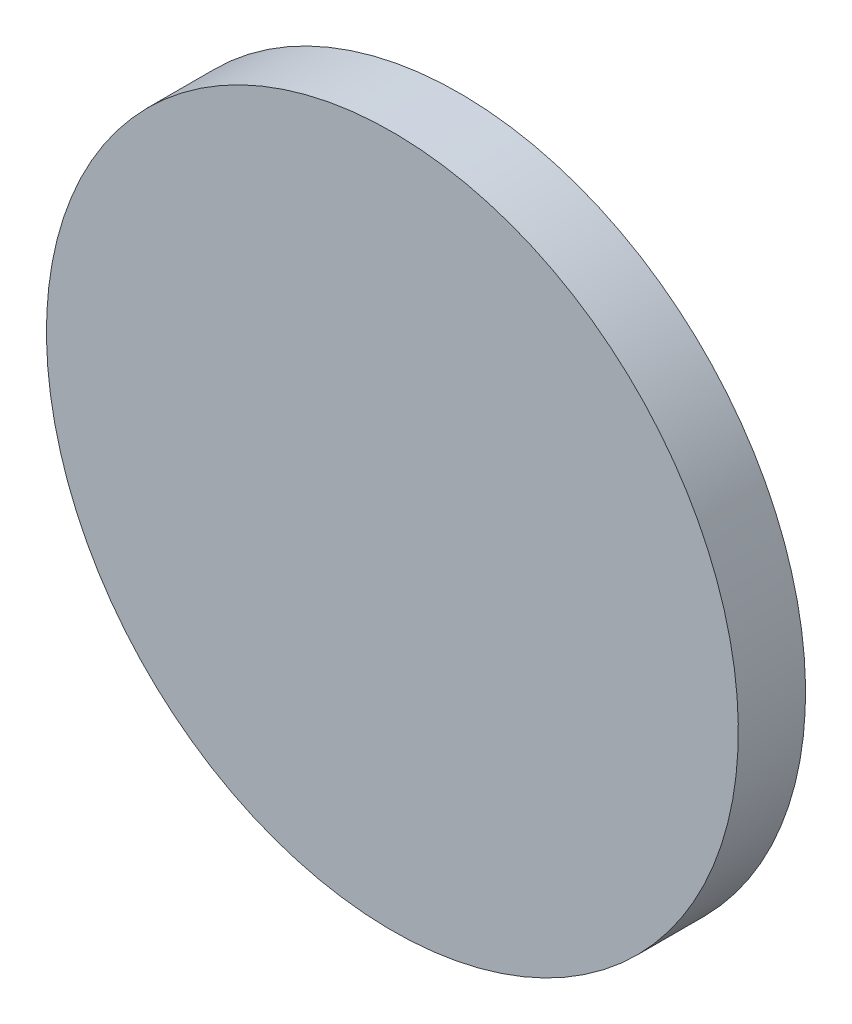
ISO-10303-21;
HEADER;
FILE_DESCRIPTION(('STEP AP214'),'2;1');
FILE_NAME('part.step','',(''),(''),'','','');
FILE_SCHEMA(('AUTOMOTIVE_DESIGN { 1 0 10303 214 1 1 1 1 }'));
ENDSEC;
DATA;
#1=APPLICATION_CONTEXT('core data for automotive mechanical design processes');
#2=APPLICATION_PROTOCOL_DEFINITION('international standard','automotive_design',2000,#1);
#3=PRODUCT_CONTEXT('',#1,'mechanical');
#4=PRODUCT('Part','Part','',(#3));
#5=PRODUCT_RELATED_PRODUCT_CATEGORY('part','',(#4));
#6=PRODUCT_DEFINITION_FORMATION('','',#4);
#7=PRODUCT_DEFINITION_CONTEXT('part definition',#1,'design');
#8=PRODUCT_DEFINITION('design','',#6,#7);
#9=PRODUCT_DEFINITION_SHAPE('','',#8);
#10=(LENGTH_UNIT() NAMED_UNIT(*) SI_UNIT(.MILLI.,.METRE.));
#11=(NAMED_UNIT(*) PLANE_ANGLE_UNIT() SI_UNIT($,.RADIAN.));
#12=(NAMED_UNIT(*) SI_UNIT($,.STERADIAN.) SOLID_ANGLE_UNIT());
#13=UNCERTAINTY_MEASURE_WITH_UNIT(LENGTH_MEASURE(1.E-05),#10,'distance_accuracy_value','');
#14=(GEOMETRIC_REPRESENTATION_CONTEXT(3) GLOBAL_UNCERTAINTY_ASSIGNED_CONTEXT((#13)) GLOBAL_UNIT_ASSIGNED_CONTEXT((#10,
#11,#12)) REPRESENTATION_CONTEXT('',''));
#15=CARTESIAN_POINT('',(0.,0.,0.));
#16=DIRECTION('',(0.,0.,1.));
#17=DIRECTION('',(1.,0.,0.));
#18=AXIS2_PLACEMENT_3D('',#15,#16,#17);
#19=CARTESIAN_POINT('',(128.,-103.,773.));
#20=DIRECTION('',(0.,0.,-1.));
#21=DIRECTION('',(0.438371146789082,-0.898794046299165,0.));
#22=AXIS2_PLACEMENT_3D('',#19,#20,#21);
#23=CYLINDRICAL_SURFACE('',#22,247.);
#24=CARTESIAN_POINT('',(128.,-103.,773.));
#25=DIRECTION('',(0.,0.,-1.));
#26=DIRECTION('',(0.438371146789082,-0.898794046299165,0.));
#27=AXIS2_PLACEMENT_3D('',#24,#25,#26);
#28=CIRCLE('',#27,247.);
#29=CARTESIAN_POINT('',(236.277673256903,-325.002129435894,773.));
#30=VERTEX_POINT('',#29);
#31=EDGE_CURVE('E13',#30,#30,#28,.T.);
#32=ORIENTED_EDGE('',*,*,#31,.T.);
#33=EDGE_LOOP('',(#32));
#34=FACE_BOUND('',#33,.T.);
#35=CARTESIAN_POINT('',(128.,-103.,725.));
#36=DIRECTION('',(0.,0.,-1.));
#37=DIRECTION('',(0.438371146789082,-0.898794046299165,0.));
#38=AXIS2_PLACEMENT_3D('',#35,#36,#37);
#39=CIRCLE('',#38,247.);
#40=CARTESIAN_POINT('',(236.277673256903,-325.002129435894,725.));
#41=VERTEX_POINT('',#40);
#42=EDGE_CURVE('E134',#41,#41,#39,.T.);
#43=ORIENTED_EDGE('',*,*,#42,.F.);
#44=EDGE_LOOP('',(#43));
#45=FACE_BOUND('',#44,.T.);
#46=ADVANCED_FACE('F131',(#34,#45),#23,.T.);
#47=CARTESIAN_POINT('',(128.,-103.,773.));
#48=DIRECTION('',(0.,0.,-1.));
#49=DIRECTION('',(0.438371146789082,-0.898794046299165,0.));
#50=AXIS2_PLACEMENT_3D('',#47,#48,#49);
#51=PLANE('',#50);
#52=ORIENTED_EDGE('',*,*,#31,.F.);
#53=EDGE_LOOP('',(#52));
#54=FACE_BOUND('',#53,.T.);
#55=ADVANCED_FACE('F680',(#54),#51,.F.);
#56=CARTESIAN_POINT('',(128.,-103.,725.));
#57=DIRECTION('',(0.,0.,-1.));
#58=DIRECTION('',(0.438371146789082,-0.898794046299165,0.));
#59=AXIS2_PLACEMENT_3D('',#56,#57,#58);
#60=PLANE('',#59);
#61=ORIENTED_EDGE('',*,*,#42,.T.);
#62=EDGE_LOOP('',(#61));
#63=FACE_BOUND('',#62,.T.);
#64=ADVANCED_FACE('F677',(#63),#60,.T.);
#65=CLOSED_SHELL('',(#46,#55,#64));
#66=CARTESIAN_POINT('',(541.260893333522,168.85087051179,737.));
#67=DIRECTION('',(0.,0.,-1.));
#68=DIRECTION('',(0.438371146789082,-0.898794046299165,0.));
#69=AXIS2_PLACEMENT_3D('',#66,#67,#68);
#70=PLANE('',#69);
#71=DIRECTION('',(0.898794046299165,0.438371146789082,0.));
#72=VECTOR('',#71,1.);
#73=CARTESIAN_POINT('',(99.7908167041226,-45.1626031206487,737.));
#74=LINE('',#73,#72);
#75=CARTESIAN_POINT('',(99.7908167041226,-45.1626031206487,737.));
#76=VERTEX_POINT('',#75);
#77=CARTESIAN_POINT('',(126.754638093098,-32.0114687169763,737.));
#78=VERTEX_POINT('',#77);
#79=EDGE_CURVE('E596',#76,#78,#74,.T.);
#80=ORIENTED_EDGE('',*,*,#79,.T.);
#81=DIRECTION('',(0.438371146789082,-0.898794046299165,0.));
#82=VECTOR('',#81,1.);
#83=CARTESIAN_POINT('',(154.963913963225,-89.849055401669,737.));
#84=LINE('',#83,#82);
#85=CARTESIAN_POINT('',(182.658670183092,-146.631720470862,737.));
#86=VERTEX_POINT('',#85);
#87=EDGE_CURVE('E378',#78,#86,#84,.T.);
#88=ORIENTED_EDGE('',*,*,#87,.T.);
#89=CARTESIAN_POINT('',(-285.260708185021,-374.851250122473,737.));
#90=DIRECTION('',(0.,0.,-1.));
#91=DIRECTION('',(0.438371146789082,-0.898794046299165,0.));
#92=AXIS2_PLACEMENT_3D('',#89,#90,#91);
#93=CIRCLE('',#92,520.608008358308);
#94=CARTESIAN_POINT('',(183.171999380492,-147.687219390398,737.));
#95=VERTEX_POINT('',#94);
#96=EDGE_CURVE('E369',#86,#95,#93,.T.);
#97=ORIENTED_EDGE('',*,*,#96,.T.);
#98=CARTESIAN_POINT('',(232.04757683889,-316.32914649979,737.));
#99=CARTESIAN_POINT('',(225.420778628669,-257.751320257743,737.));
#100=CARTESIAN_POINT('',(208.892636429134,-200.725489675444,737.));
#101=CARTESIAN_POINT('',(183.171999380492,-147.687219390398,737.));
#102=B_SPLINE_CURVE_WITH_KNOTS('',3,(#98,#99,#100,#101),.UNSPECIFIED.,.F.,.F.,(4,4),(0.,1.),.UNSPECIFIED.);
#103=CARTESIAN_POINT('',(232.04757683889,-316.32914649979,737.));
#104=VERTEX_POINT('',#103);
#105=EDGE_CURVE('E276',#104,#95,#102,.T.);
#106=ORIENTED_EDGE('',*,*,#105,.F.);
#107=DIRECTION('',(-0.438371146789082,0.898794046299165,0.));
#108=VECTOR('',#107,1.);
#109=CARTESIAN_POINT('',(232.04757683889,-316.32914649979,737.));
#110=LINE('',#109,#108);
#111=CARTESIAN_POINT('',(156.209368444378,-160.837776490034,737.));
#112=VERTEX_POINT('',#111);
#113=EDGE_CURVE('E785',#104,#112,#110,.T.);
#114=ORIENTED_EDGE('',*,*,#113,.T.);
#115=DIRECTION('',(-0.898794046299165,-0.438371146789082,0.));
#116=VECTOR('',#115,1.);
#117=CARTESIAN_POINT('',(156.209368444378,-160.837776490034,737.));
#118=LINE('',#117,#116);
#119=CARTESIAN_POINT('',(129.245547055403,-173.988910893707,737.));
#120=VERTEX_POINT('',#119);
#121=EDGE_CURVE('E627',#112,#120,#118,.T.);
#122=ORIENTED_EDGE('',*,*,#121,.T.);
#123=DIRECTION('',(-0.438371146789082,0.898794046299165,0.));
#124=VECTOR('',#123,1.);
#125=CARTESIAN_POINT('',(101.036271185276,-116.151324209014,737.));
#126=LINE('',#125,#124);
#127=CARTESIAN_POINT('',(73.3415149654093,-59.3686591398207,737.));
#128=VERTEX_POINT('',#127);
#129=EDGE_CURVE('E377',#120,#128,#126,.T.);
#130=ORIENTED_EDGE('',*,*,#129,.T.);
#131=CARTESIAN_POINT('',(73.3415149654092,-59.3686591398207,737.));
#132=CARTESIAN_POINT('',(63.6037527016472,-39.4032877620438,737.));
#133=CARTESIAN_POINT('',(55.6022477620849,-18.6814689620213,737.));
#134=CARTESIAN_POINT('',(47.6004728340155,2.04104903808489,737.));
#135=CARTESIAN_POINT('',(41.3932195653162,23.368888505886,737.));
#136=CARTESIAN_POINT('',(35.1856868586259,44.6976881098945,737.));
#137=CARTESIAN_POINT('',(30.8177154005894,66.4767504006402,737.));
#138=CARTESIAN_POINT('',(26.4495965495658,88.2565476048525,737.));
#139=CARTESIAN_POINT('',(23.9526083096114,110.328766889107,737.));
#140=B_SPLINE_CURVE_WITH_KNOTS('',2,(#131,#132,#133,#134,#135,#136,#137,#138,#139),
.UNSPECIFIED.,.F.,.F.,(3,2,2,2,3),(0.,0.25,0.5,0.75,1.),.UNSPECIFIED.);
#141=CARTESIAN_POINT('',(72.8281857680085,-58.313160220285,737.));
#142=VERTEX_POINT('',#141);
#143=EDGE_CURVE('E547',#128,#142,#140,.T.);
#144=ORIENTED_EDGE('',*,*,#143,.T.);
#145=CARTESIAN_POINT('',(23.9526083096115,110.328766889107,737.));
#146=CARTESIAN_POINT('',(30.5794065198317,51.7509406470606,737.));
#147=CARTESIAN_POINT('',(47.1075487193666,-5.27488993523928,737.));
#148=CARTESIAN_POINT('',(72.8281857680085,-58.313160220285,737.));
#149=B_SPLINE_CURVE_WITH_KNOTS('',3,(#145,#146,#147,#148),.UNSPECIFIED.,.F.,.F.,(4,4),(0.,1.),.UNSPECIFIED.);
#150=CARTESIAN_POINT('',(23.9526083096115,110.328766889107,737.));
#151=VERTEX_POINT('',#150);
#152=EDGE_CURVE('E449',#151,#142,#149,.T.);
#153=ORIENTED_EDGE('',*,*,#152,.F.);
#154=DIRECTION('',(0.438371146789082,-0.898794046299165,0.));
#155=VECTOR('',#154,1.);
#156=CARTESIAN_POINT('',(23.9526083096115,110.328766889107,737.));
#157=LINE('',#156,#155);
#158=EDGE_CURVE('E562',#151,#76,#157,.T.);
#159=ORIENTED_EDGE('',*,*,#158,.T.);
#160=EDGE_LOOP('',(#80,#88,#97,#106,#114,#122,#130,#144,#153,#159));
#161=FACE_BOUND('',#160,.T.);
#162=ADVANCED_FACE('F360',(#161),#70,.T.);
#163=CARTESIAN_POINT('',(541.260893333522,168.85087051179,737.));
#164=DIRECTION('',(0.,0.,-1.));
#165=DIRECTION('',(0.438371146789082,-0.898794046299165,0.));
#166=AXIS2_PLACEMENT_3D('',#163,#164,#165);
#167=CYLINDRICAL_SURFACE('',#166,520.608008358308);
#168=DIRECTION('',(0.,0.,1.));
#169=VECTOR('',#168,1.);
#170=CARTESIAN_POINT('',(72.8269953151477,-58.3137375243212,731.));
#171=LINE('',#170,#169);
#172=CARTESIAN_POINT('',(72.8281834648773,-58.3131580278022,731.));
#173=VERTEX_POINT('',#172);
#174=EDGE_CURVE('E476',#173,#142,#171,.T.);
#175=ORIENTED_EDGE('',*,*,#174,.T.);
#176=ORIENTED_EDGE('',*,*,#143,.F.);
#177=DIRECTION('',(0.,0.,1.));
#178=VECTOR('',#177,1.);
#179=CARTESIAN_POINT('',(73.3415149654095,-59.3686591398211,731.));
#180=LINE('',#179,#178);
#181=CARTESIAN_POINT('',(73.3415149654094,-59.3686591398209,731.));
#182=VERTEX_POINT('',#181);
#183=EDGE_CURVE('E666',#182,#128,#180,.T.);
#184=ORIENTED_EDGE('',*,*,#183,.F.);
#185=CARTESIAN_POINT('',(541.260893333522,168.85087051179,731.));
#186=DIRECTION('',(0.,0.,-1.));
#187=DIRECTION('',(0.438371146789082,-0.898794046299165,0.));
#188=AXIS2_PLACEMENT_3D('',#185,#186,#187);
#189=CIRCLE('',#188,520.608008358308);
#190=EDGE_CURVE('E783',#182,#173,#189,.T.);
#191=ORIENTED_EDGE('',*,*,#190,.T.);
#192=EDGE_LOOP('',(#175,#176,#184,#191));
#193=FACE_BOUND('',#192,.T.);
#194=ADVANCED_FACE('F359',(#193),#167,.F.);
#195=CARTESIAN_POINT('',(205.083755449915,-329.480280903462,737.));
#196=DIRECTION('',(0.438371146789082,-0.898794046299165,0.));
#197=DIRECTION('',(0.,0.,1.));
#198=AXIS2_PLACEMENT_3D('',#195,#196,#197);
#199=PLANE('',#198);
#200=DIRECTION('',(-0.898794046299165,-0.438371146789082,0.));
#201=VECTOR('',#200,1.);
#202=CARTESIAN_POINT('',(205.083755449915,-329.480280903462,731.));
#203=LINE('',#202,#201);
#204=CARTESIAN_POINT('',(232.04757683889,-316.32914649979,731.));
#205=VERTEX_POINT('',#204);
#206=CARTESIAN_POINT('',(205.083755449915,-329.480280903462,731.));
#207=VERTEX_POINT('',#206);
#208=EDGE_CURVE('E789',#205,#207,#203,.T.);
#209=ORIENTED_EDGE('',*,*,#208,.T.);
#210=DIRECTION('',(0.,0.,-1.));
#211=VECTOR('',#210,1.);
#212=CARTESIAN_POINT('',(205.083755449915,-329.480280903462,737.));
#213=LINE('',#212,#211);
#214=CARTESIAN_POINT('',(205.083755449915,-329.480280903462,743.));
#215=VERTEX_POINT('',#214);
#216=EDGE_CURVE('E650',#215,#207,#213,.T.);
#217=ORIENTED_EDGE('',*,*,#216,.F.);
#218=DIRECTION('',(0.898794046299165,0.438371146789082,0.));
#219=VECTOR('',#218,1.);
#220=CARTESIAN_POINT('',(229.351194699992,-317.644259940157,743.));
#221=LINE('',#220,#219);
#222=CARTESIAN_POINT('',(226.654812561095,-318.959373380524,743.));
#223=VERTEX_POINT('',#222);
#224=EDGE_CURVE('E624',#215,#223,#221,.T.);
#225=ORIENTED_EDGE('',*,*,#224,.T.);
#226=DIRECTION('',(0.,0.,1.));
#227=VECTOR('',#226,1.);
#228=CARTESIAN_POINT('',(226.654812561095,-318.959373380524,767.));
#229=LINE('',#228,#227);
#230=CARTESIAN_POINT('',(226.654812561095,-318.959373380524,767.));
#231=VERTEX_POINT('',#230);
#232=EDGE_CURVE('E609',#223,#231,#229,.T.);
#233=ORIENTED_EDGE('',*,*,#232,.T.);
#234=DIRECTION('',(0.898794046299165,0.438371146789082,0.));
#235=VECTOR('',#234,1.);
#236=CARTESIAN_POINT('',(229.351194699992,-317.644259940157,767.));
#237=LINE('',#236,#235);
#238=CARTESIAN_POINT('',(232.04757683889,-316.32914649979,767.));
#239=VERTEX_POINT('',#238);
#240=EDGE_CURVE('E640',#231,#239,#237,.T.);
#241=ORIENTED_EDGE('',*,*,#240,.T.);
#242=DIRECTION('',(0.,0.,-1.));
#243=VECTOR('',#242,1.);
#244=CARTESIAN_POINT('',(232.04757683889,-316.32914649979,767.));
#245=LINE('',#244,#243);
#246=EDGE_CURVE('E270',#239,#104,#245,.T.);
#247=ORIENTED_EDGE('',*,*,#246,.T.);
#248=DIRECTION('',(-0.803905834118811,-0.39209107343797,0.447213595499958));
#249=VECTOR('',#248,1.);
#250=CARTESIAN_POINT('',(232.04757683889,-316.32914649979,737.));
#251=LINE('',#250,#249);
#252=CARTESIAN_POINT('',(237.440341116685,-313.698919619055,734.));
#253=VERTEX_POINT('',#252);
#254=EDGE_CURVE('E261',#253,#104,#251,.T.);
#255=ORIENTED_EDGE('',*,*,#254,.F.);
#256=DIRECTION('',(0.803905834118811,0.39209107343797,0.447213595499958));
#257=VECTOR('',#256,1.);
#258=CARTESIAN_POINT('',(232.04757683889,-316.32914649979,731.));
#259=LINE('',#258,#257);
#260=EDGE_CURVE('E267',#205,#253,#259,.T.);
#261=ORIENTED_EDGE('',*,*,#260,.F.);
#262=EDGE_LOOP('',(#209,#217,#225,#233,#241,#247,#255,#261));
#263=FACE_BOUND('',#262,.T.);
#264=ADVANCED_FACE('F265',(#263),#199,.F.);
#265=CARTESIAN_POINT('',(-285.260708185021,-374.851250122473,737.));
#266=DIRECTION('',(0.,0.,-1.));
#267=DIRECTION('',(0.438371146789082,-0.898794046299165,0.));
#268=AXIS2_PLACEMENT_3D('',#265,#266,#267);
#269=CYLINDRICAL_SURFACE('',#268,520.608008358308);
#270=DIRECTION('',(0.,0.,1.));
#271=VECTOR('',#270,1.);
#272=CARTESIAN_POINT('',(183.173189833353,-147.686642086362,731.));
#273=LINE('',#272,#271);
#274=CARTESIAN_POINT('',(183.172001681919,-147.687221583717,731.));
#275=VERTEX_POINT('',#274);
#276=EDGE_CURVE('E147',#275,#95,#273,.T.);
#277=ORIENTED_EDGE('',*,*,#276,.T.);
#278=ORIENTED_EDGE('',*,*,#96,.F.);
#279=DIRECTION('',(0.,0.,-1.));
#280=VECTOR('',#279,1.);
#281=CARTESIAN_POINT('',(182.658670183092,-146.631720470862,737.));
#282=LINE('',#281,#280);
#283=CARTESIAN_POINT('',(182.658670183092,-146.631720470862,731.));
#284=VERTEX_POINT('',#283);
#285=EDGE_CURVE('E559',#86,#284,#282,.T.);
#286=ORIENTED_EDGE('',*,*,#285,.T.);
#287=CARTESIAN_POINT('',(-285.260708185021,-374.851250122473,731.));
#288=DIRECTION('',(0.,0.,-1.));
#289=DIRECTION('',(0.898794046299165,0.438371146789082,0.));
#290=AXIS2_PLACEMENT_3D('',#287,#288,#289);
#291=CIRCLE('',#290,520.608008358308);
#292=EDGE_CURVE('E484',#284,#275,#291,.T.);
#293=ORIENTED_EDGE('',*,*,#292,.T.);
#294=EDGE_LOOP('',(#277,#278,#286,#293));
#295=FACE_BOUND('',#294,.T.);
#296=ADVANCED_FACE('F358',(#295),#269,.F.);
#297=CARTESIAN_POINT('',(261.334580157346,-307.94124093082,731.));
#298=DIRECTION('',(0.,0.,1.));
#299=DIRECTION('',(-0.438371146789082,0.898794046299165,0.));
#300=AXIS2_PLACEMENT_3D('',#297,#298,#299);
#301=PLANE('',#300);
#302=DIRECTION('',(-0.438371146789082,0.898794046299165,0.));
#303=VECTOR('',#302,1.);
#304=CARTESIAN_POINT('',(183.48863191054,-148.333394189014,731.));
#305=LINE('',#304,#303);
#306=CARTESIAN_POINT('',(50.9164296985865,123.479901292779,731.));
#307=VERTEX_POINT('',#306);
#308=EDGE_CURVE('E654',#284,#307,#305,.T.);
#309=ORIENTED_EDGE('',*,*,#308,.T.);
#310=DIRECTION('',(-0.898794046299165,-0.438371146789082,0.));
#311=VECTOR('',#310,1.);
#312=CARTESIAN_POINT('',(50.9164296985865,123.479901292779,731.));
#313=LINE('',#312,#311);
#314=CARTESIAN_POINT('',(23.9526083096115,110.328766889107,731.));
#315=VERTEX_POINT('',#314);
#316=EDGE_CURVE('E658',#307,#315,#313,.T.);
#317=ORIENTED_EDGE('',*,*,#316,.T.);
#318=CARTESIAN_POINT('',(23.9526083096115,110.328766889107,731.));
#319=CARTESIAN_POINT('',(30.5794065198317,51.7509406470606,731.));
#320=CARTESIAN_POINT('',(47.1075487193666,-5.27488993523928,731.));
#321=CARTESIAN_POINT('',(72.8281857680085,-58.313160220285,731.));
#322=B_SPLINE_CURVE_WITH_KNOTS('',3,(#318,#319,#320,#321),.UNSPECIFIED.,.F.,.F.,(4,4),(0.,1.),.UNSPECIFIED.);
#323=EDGE_CURVE('E444',#315,#173,#322,.T.);
#324=ORIENTED_EDGE('',*,*,#323,.T.);
#325=ORIENTED_EDGE('',*,*,#190,.F.);
#326=DIRECTION('',(0.438371146789082,-0.898794046299165,0.));
#327=VECTOR('',#326,1.);
#328=CARTESIAN_POINT('',(73.3415149654093,-59.3686591398207,731.));
#329=LINE('',#328,#327);
#330=EDGE_CURVE('E670',#182,#207,#329,.T.);
#331=ORIENTED_EDGE('',*,*,#330,.T.);
#332=ORIENTED_EDGE('',*,*,#208,.F.);
#333=CARTESIAN_POINT('',(232.04757683889,-316.32914649979,731.));
#334=CARTESIAN_POINT('',(225.420778628669,-257.751320257743,731.));
#335=CARTESIAN_POINT('',(208.892636429134,-200.725489675444,731.));
#336=CARTESIAN_POINT('',(183.171999380492,-147.687219390398,731.));
#337=B_SPLINE_CURVE_WITH_KNOTS('',3,(#333,#334,#335,#336),.UNSPECIFIED.,.F.,.F.,(4,4),(0.,1.),.UNSPECIFIED.);
#338=EDGE_CURVE('E288',#205,#275,#337,.T.);
#339=ORIENTED_EDGE('',*,*,#338,.T.);
#340=ORIENTED_EDGE('',*,*,#292,.F.);
#341=EDGE_LOOP('',(#309,#317,#324,#325,#331,#332,#339,#340));
#342=FACE_BOUND('',#341,.T.);
#343=ADVANCED_FACE('F490',(#342),#301,.T.);
#344=CARTESIAN_POINT('',(73.3415149654095,-59.3686591398211,731.));
#345=DIRECTION('',(-0.898794046299165,-0.438371146789082,0.));
#346=DIRECTION('',(0.438371146789082,-0.898794046299165,0.));
#347=AXIS2_PLACEMENT_3D('',#344,#345,#346);
#348=PLANE('',#347);
#349=ORIENTED_EDGE('',*,*,#330,.F.);
#350=ORIENTED_EDGE('',*,*,#183,.T.);
#351=ORIENTED_EDGE('',*,*,#129,.F.);
#352=DIRECTION('',(0.,0.,1.));
#353=VECTOR('',#352,1.);
#354=CARTESIAN_POINT('',(129.245547055403,-173.988910893707,737.));
#355=LINE('',#354,#353);
#356=CARTESIAN_POINT('',(129.245547055403,-173.988910893707,743.));
#357=VERTEX_POINT('',#356);
#358=EDGE_CURVE('E636',#120,#357,#355,.T.);
#359=ORIENTED_EDGE('',*,*,#358,.T.);
#360=DIRECTION('',(0.438371146789082,-0.898794046299165,0.));
#361=VECTOR('',#360,1.);
#362=CARTESIAN_POINT('',(205.083755449915,-329.480280903462,743.));
#363=LINE('',#362,#361);
#364=EDGE_CURVE('E620',#357,#215,#363,.T.);
#365=ORIENTED_EDGE('',*,*,#364,.T.);
#366=ORIENTED_EDGE('',*,*,#216,.T.);
#367=EDGE_LOOP('',(#349,#350,#351,#359,#365,#366));
#368=FACE_BOUND('',#367,.T.);
#369=ADVANCED_FACE('F500',(#368),#348,.F.);
#370=CARTESIAN_POINT('',(50.9164296985865,123.479901292779,731.));
#371=DIRECTION('',(-0.438371146789082,0.898794046299165,0.));
#372=DIRECTION('',(-0.898794046299165,-0.438371146789082,0.));
#373=AXIS2_PLACEMENT_3D('',#370,#371,#372);
#374=PLANE('',#373);
#375=ORIENTED_EDGE('',*,*,#316,.F.);
#376=DIRECTION('',(0.,0.,1.));
#377=VECTOR('',#376,1.);
#378=CARTESIAN_POINT('',(50.9164296985865,123.479901292779,731.));
#379=LINE('',#378,#377);
#380=CARTESIAN_POINT('',(50.9164296985865,123.479901292779,743.));
#381=VERTEX_POINT('',#380);
#382=EDGE_CURVE('E655',#307,#381,#379,.T.);
#383=ORIENTED_EDGE('',*,*,#382,.T.);
#384=DIRECTION('',(-0.898794046299165,-0.438371146789082,0.));
#385=VECTOR('',#384,1.);
#386=CARTESIAN_POINT('',(26.648990448509,111.643880329474,743.));
#387=LINE('',#386,#385);
#388=CARTESIAN_POINT('',(29.3453725874065,112.958993769841,743.));
#389=VERTEX_POINT('',#388);
#390=EDGE_CURVE('E587',#381,#389,#387,.T.);
#391=ORIENTED_EDGE('',*,*,#390,.T.);
#392=DIRECTION('',(0.,0.,1.));
#393=VECTOR('',#392,1.);
#394=CARTESIAN_POINT('',(29.3453725874065,112.958993769841,767.));
#395=LINE('',#394,#393);
#396=CARTESIAN_POINT('',(29.3453725874065,112.958993769841,767.));
#397=VERTEX_POINT('',#396);
#398=EDGE_CURVE('E853',#389,#397,#395,.T.);
#399=ORIENTED_EDGE('',*,*,#398,.T.);
#400=DIRECTION('',(-0.898794046299165,-0.438371146789082,0.));
#401=VECTOR('',#400,1.);
#402=CARTESIAN_POINT('',(26.648990448509,111.643880329474,767.));
#403=LINE('',#402,#401);
#404=CARTESIAN_POINT('',(23.9526083096115,110.328766889107,767.));
#405=VERTEX_POINT('',#404);
#406=EDGE_CURVE('E576',#397,#405,#403,.T.);
#407=ORIENTED_EDGE('',*,*,#406,.T.);
#408=DIRECTION('',(0.,0.,-1.));
#409=VECTOR('',#408,1.);
#410=CARTESIAN_POINT('',(23.9526083096115,110.328766889107,767.));
#411=LINE('',#410,#409);
#412=EDGE_CURVE('E567',#405,#151,#411,.T.);
#413=ORIENTED_EDGE('',*,*,#412,.T.);
#414=DIRECTION('',(0.803905834118811,0.39209107343797,0.447213595499958));
#415=VECTOR('',#414,1.);
#416=CARTESIAN_POINT('',(23.9526083096115,110.328766889107,737.));
#417=LINE('',#416,#415);
#418=CARTESIAN_POINT('',(18.5598440318165,107.698540008372,734.));
#419=VERTEX_POINT('',#418);
#420=EDGE_CURVE('E458',#419,#151,#417,.T.);
#421=ORIENTED_EDGE('',*,*,#420,.F.);
#422=DIRECTION('',(-0.803905834118811,-0.39209107343797,0.447213595499958));
#423=VECTOR('',#422,1.);
#424=CARTESIAN_POINT('',(23.9526083096115,110.328766889107,731.));
#425=LINE('',#424,#423);
#426=EDGE_CURVE('E454',#315,#419,#425,.T.);
#427=ORIENTED_EDGE('',*,*,#426,.F.);
#428=EDGE_LOOP('',(#375,#383,#391,#399,#407,#413,#421,#427));
#429=FACE_BOUND('',#428,.T.);
#430=ADVANCED_FACE('F691',(#429),#374,.F.);
#431=CARTESIAN_POINT('',(183.48863191054,-148.333394189014,731.));
#432=DIRECTION('',(0.898794046299165,0.438371146789082,0.));
#433=DIRECTION('',(-0.438371146789082,0.898794046299165,0.));
#434=AXIS2_PLACEMENT_3D('',#431,#432,#433);
#435=PLANE('',#434);
#436=ORIENTED_EDGE('',*,*,#382,.F.);
#437=ORIENTED_EDGE('',*,*,#308,.F.);
#438=ORIENTED_EDGE('',*,*,#285,.F.);
#439=ORIENTED_EDGE('',*,*,#87,.F.);
#440=DIRECTION('',(0.,0.,1.));
#441=VECTOR('',#440,1.);
#442=CARTESIAN_POINT('',(126.754638093098,-32.0114687169763,737.));
#443=LINE('',#442,#441);
#444=CARTESIAN_POINT('',(126.754638093098,-32.0114687169763,743.));
#445=VERTEX_POINT('',#444);
#446=EDGE_CURVE('E583',#78,#445,#443,.T.);
#447=ORIENTED_EDGE('',*,*,#446,.T.);
#448=DIRECTION('',(-0.438371146789082,0.898794046299165,0.));
#449=VECTOR('',#448,1.);
#450=CARTESIAN_POINT('',(50.9164296985865,123.479901292779,743.));
#451=LINE('',#450,#449);
#452=EDGE_CURVE('E863',#445,#381,#451,.T.);
#453=ORIENTED_EDGE('',*,*,#452,.T.);
#454=EDGE_LOOP('',(#436,#437,#438,#439,#447,#453));
#455=FACE_BOUND('',#454,.T.);
#456=ADVANCED_FACE('F501',(#455),#435,.F.);
#457=CARTESIAN_POINT('',(232.04757683889,-316.32914649979,767.));
#458=DIRECTION('',(0.898794046299165,0.438371146789082,0.));
#459=DIRECTION('',(0.,0.,-1.));
#460=AXIS2_PLACEMENT_3D('',#457,#458,#459);
#461=PLANE('',#460);
#462=ORIENTED_EDGE('',*,*,#113,.F.);
#463=ORIENTED_EDGE('',*,*,#246,.F.);
#464=DIRECTION('',(-0.438371146789082,0.898794046299165,0.));
#465=VECTOR('',#464,1.);
#466=CARTESIAN_POINT('',(232.04757683889,-316.32914649979,767.));
#467=LINE('',#466,#465);
#468=CARTESIAN_POINT('',(156.209368444378,-160.837776490034,767.));
#469=VERTEX_POINT('',#468);
#470=EDGE_CURVE('E643',#239,#469,#467,.T.);
#471=ORIENTED_EDGE('',*,*,#470,.T.);
#472=DIRECTION('',(0.,0.,-1.));
#473=VECTOR('',#472,1.);
#474=CARTESIAN_POINT('',(156.209368444378,-160.837776490034,767.));
#475=LINE('',#474,#473);
#476=EDGE_CURVE('E628',#469,#112,#475,.T.);
#477=ORIENTED_EDGE('',*,*,#476,.T.);
#478=EDGE_LOOP('',(#462,#463,#471,#477));
#479=FACE_BOUND('',#478,.T.);
#480=ADVANCED_FACE('F928',(#479),#461,.F.);
#481=CARTESIAN_POINT('',(229.351194699992,-317.644259940157,767.));
#482=DIRECTION('',(0.,0.,1.));
#483=DIRECTION('',(0.898794046299165,0.438371146789082,0.));
#484=AXIS2_PLACEMENT_3D('',#481,#482,#483);
#485=PLANE('',#484);
#486=ORIENTED_EDGE('',*,*,#470,.F.);
#487=ORIENTED_EDGE('',*,*,#240,.F.);
#488=DIRECTION('',(-0.438371146789082,0.898794046299165,0.));
#489=VECTOR('',#488,1.);
#490=CARTESIAN_POINT('',(150.816604166583,-163.468003370769,767.));
#491=LINE('',#490,#489);
#492=CARTESIAN_POINT('',(150.816604166583,-163.468003370769,767.));
#493=VERTEX_POINT('',#492);
#494=EDGE_CURVE('E613',#231,#493,#491,.T.);
#495=ORIENTED_EDGE('',*,*,#494,.T.);
#496=DIRECTION('',(0.898794046299165,0.438371146789082,0.));
#497=VECTOR('',#496,1.);
#498=CARTESIAN_POINT('',(153.512986305481,-162.152889930401,767.));
#499=LINE('',#498,#497);
#500=EDGE_CURVE('E632',#493,#469,#499,.T.);
#501=ORIENTED_EDGE('',*,*,#500,.T.);
#502=EDGE_LOOP('',(#486,#487,#495,#501));
#503=FACE_BOUND('',#502,.T.);
#504=ADVANCED_FACE('F934',(#503),#485,.F.);
#505=CARTESIAN_POINT('',(156.209368444378,-160.837776490034,737.));
#506=DIRECTION('',(-0.438371146789082,0.898794046299165,0.));
#507=DIRECTION('',(-0.898794046299165,-0.438371146789082,0.));
#508=AXIS2_PLACEMENT_3D('',#505,#506,#507);
#509=PLANE('',#508);
#510=DIRECTION('',(0.,0.,-1.));
#511=VECTOR('',#510,1.);
#512=CARTESIAN_POINT('',(150.816604166583,-163.468003370769,767.));
#513=LINE('',#512,#511);
#514=CARTESIAN_POINT('',(150.816604166583,-163.468003370769,743.));
#515=VERTEX_POINT('',#514);
#516=EDGE_CURVE('E566',#493,#515,#513,.T.);
#517=ORIENTED_EDGE('',*,*,#516,.T.);
#518=DIRECTION('',(-0.898794046299165,-0.438371146789082,0.));
#519=VECTOR('',#518,1.);
#520=CARTESIAN_POINT('',(153.512986305481,-162.152889930401,743.));
#521=LINE('',#520,#519);
#522=EDGE_CURVE('E617',#515,#357,#521,.T.);
#523=ORIENTED_EDGE('',*,*,#522,.T.);
#524=ORIENTED_EDGE('',*,*,#358,.F.);
#525=ORIENTED_EDGE('',*,*,#121,.F.);
#526=ORIENTED_EDGE('',*,*,#476,.F.);
#527=ORIENTED_EDGE('',*,*,#500,.F.);
#528=EDGE_LOOP('',(#517,#523,#524,#525,#526,#527));
#529=FACE_BOUND('',#528,.T.);
#530=ADVANCED_FACE('F943',(#529),#509,.F.);
#531=CARTESIAN_POINT('',(232.04757683889,-316.32914649979,743.));
#532=DIRECTION('',(0.,0.,1.));
#533=DIRECTION('',(-0.438371146789082,0.898794046299165,0.));
#534=AXIS2_PLACEMENT_3D('',#531,#532,#533);
#535=PLANE('',#534);
#536=DIRECTION('',(0.438371146789082,-0.898794046299165,0.));
#537=VECTOR('',#536,1.);
#538=CARTESIAN_POINT('',(150.816604166583,-163.468003370769,743.));
#539=LINE('',#538,#537);
#540=EDGE_CURVE('E605',#515,#223,#539,.T.);
#541=ORIENTED_EDGE('',*,*,#540,.T.);
#542=ORIENTED_EDGE('',*,*,#224,.F.);
#543=ORIENTED_EDGE('',*,*,#364,.F.);
#544=ORIENTED_EDGE('',*,*,#522,.F.);
#545=EDGE_LOOP('',(#541,#542,#543,#544));
#546=FACE_BOUND('',#545,.T.);
#547=ADVANCED_FACE('F952',(#546),#535,.F.);
#548=CARTESIAN_POINT('',(226.654812561095,-318.959373380524,737.));
#549=DIRECTION('',(-0.898794046299165,-0.438371146789082,0.));
#550=DIRECTION('',(0.438371146789082,-0.898794046299165,0.));
#551=AXIS2_PLACEMENT_3D('',#548,#549,#550);
#552=PLANE('',#551);
#553=ORIENTED_EDGE('',*,*,#516,.F.);
#554=ORIENTED_EDGE('',*,*,#494,.F.);
#555=ORIENTED_EDGE('',*,*,#232,.F.);
#556=ORIENTED_EDGE('',*,*,#540,.F.);
#557=EDGE_LOOP('',(#553,#554,#555,#556));
#558=FACE_BOUND('',#557,.T.);
#559=ADVANCED_FACE('F960',(#558),#552,.F.);
#560=CARTESIAN_POINT('',(23.9526083096115,110.328766889107,767.));
#561=DIRECTION('',(-0.898794046299165,-0.438371146789082,0.));
#562=DIRECTION('',(0.,0.,-1.));
#563=AXIS2_PLACEMENT_3D('',#560,#561,#562);
#564=PLANE('',#563);
#565=ORIENTED_EDGE('',*,*,#158,.F.);
#566=ORIENTED_EDGE('',*,*,#412,.F.);
#567=DIRECTION('',(0.438371146789082,-0.898794046299165,0.));
#568=VECTOR('',#567,1.);
#569=CARTESIAN_POINT('',(23.9526083096115,110.328766889107,767.));
#570=LINE('',#569,#568);
#571=CARTESIAN_POINT('',(99.7908167041226,-45.1626031206487,767.));
#572=VERTEX_POINT('',#571);
#573=EDGE_CURVE('E571',#405,#572,#570,.T.);
#574=ORIENTED_EDGE('',*,*,#573,.T.);
#575=DIRECTION('',(0.,0.,-1.));
#576=VECTOR('',#575,1.);
#577=CARTESIAN_POINT('',(99.7908167041226,-45.1626031206487,767.));
#578=LINE('',#577,#576);
#579=EDGE_CURVE('E593',#572,#76,#578,.T.);
#580=ORIENTED_EDGE('',*,*,#579,.T.);
#581=EDGE_LOOP('',(#565,#566,#574,#580));
#582=FACE_BOUND('',#581,.T.);
#583=ADVANCED_FACE('F837',(#582),#564,.F.);
#584=CARTESIAN_POINT('',(26.648990448509,111.643880329474,767.));
#585=DIRECTION('',(0.,0.,1.));
#586=DIRECTION('',(-0.898794046299165,-0.438371146789082,0.));
#587=AXIS2_PLACEMENT_3D('',#584,#585,#586);
#588=PLANE('',#587);
#589=ORIENTED_EDGE('',*,*,#573,.F.);
#590=ORIENTED_EDGE('',*,*,#406,.F.);
#591=DIRECTION('',(0.438371146789082,-0.898794046299165,0.));
#592=VECTOR('',#591,1.);
#593=CARTESIAN_POINT('',(105.183580981918,-42.5323762399142,767.));
#594=LINE('',#593,#592);
#595=CARTESIAN_POINT('',(105.183580981918,-42.5323762399142,767.));
#596=VERTEX_POINT('',#595);
#597=EDGE_CURVE('E843',#397,#596,#594,.T.);
#598=ORIENTED_EDGE('',*,*,#597,.T.);
#599=DIRECTION('',(-0.898794046299165,-0.438371146789082,0.));
#600=VECTOR('',#599,1.);
#601=CARTESIAN_POINT('',(102.48719884302,-43.8474896802815,767.));
#602=LINE('',#601,#600);
#603=EDGE_CURVE('E592',#596,#572,#602,.T.);
#604=ORIENTED_EDGE('',*,*,#603,.T.);
#605=EDGE_LOOP('',(#589,#590,#598,#604));
#606=FACE_BOUND('',#605,.T.);
#607=ADVANCED_FACE('F839',(#606),#588,.F.);
#608=CARTESIAN_POINT('',(99.7908167041226,-45.1626031206487,737.));
#609=DIRECTION('',(0.438371146789082,-0.898794046299165,0.));
#610=DIRECTION('',(0.898794046299165,0.438371146789082,0.));
#611=AXIS2_PLACEMENT_3D('',#608,#609,#610);
#612=PLANE('',#611);
#613=DIRECTION('',(0.,0.,-1.));
#614=VECTOR('',#613,1.);
#615=CARTESIAN_POINT('',(105.183580981918,-42.5323762399142,767.));
#616=LINE('',#615,#614);
#617=CARTESIAN_POINT('',(105.183580981918,-42.5323762399142,743.));
#618=VERTEX_POINT('',#617);
#619=EDGE_CURVE('E475',#596,#618,#616,.T.);
#620=ORIENTED_EDGE('',*,*,#619,.T.);
#621=DIRECTION('',(0.898794046299165,0.438371146789082,0.));
#622=VECTOR('',#621,1.);
#623=CARTESIAN_POINT('',(102.48719884302,-43.8474896802815,743.));
#624=LINE('',#623,#622);
#625=EDGE_CURVE('E846',#618,#445,#624,.T.);
#626=ORIENTED_EDGE('',*,*,#625,.T.);
#627=ORIENTED_EDGE('',*,*,#446,.F.);
#628=ORIENTED_EDGE('',*,*,#79,.F.);
#629=ORIENTED_EDGE('',*,*,#579,.F.);
#630=ORIENTED_EDGE('',*,*,#603,.F.);
#631=EDGE_LOOP('',(#620,#626,#627,#628,#629,#630));
#632=FACE_BOUND('',#631,.T.);
#633=ADVANCED_FACE('F836',(#632),#612,.F.);
#634=CARTESIAN_POINT('',(23.9526083096115,110.328766889107,743.));
#635=DIRECTION('',(0.,0.,1.));
#636=DIRECTION('',(0.438371146789082,-0.898794046299165,0.));
#637=AXIS2_PLACEMENT_3D('',#634,#635,#636);
#638=PLANE('',#637);
#639=DIRECTION('',(-0.438371146789082,0.898794046299165,0.));
#640=VECTOR('',#639,1.);
#641=CARTESIAN_POINT('',(105.183580981918,-42.5323762399142,743.));
#642=LINE('',#641,#640);
#643=EDGE_CURVE('E849',#618,#389,#642,.T.);
#644=ORIENTED_EDGE('',*,*,#643,.T.);
#645=ORIENTED_EDGE('',*,*,#390,.F.);
#646=ORIENTED_EDGE('',*,*,#452,.F.);
#647=ORIENTED_EDGE('',*,*,#625,.F.);
#648=EDGE_LOOP('',(#644,#645,#646,#647));
#649=FACE_BOUND('',#648,.T.);
#650=ADVANCED_FACE('F871',(#649),#638,.F.);
#651=CARTESIAN_POINT('',(29.3453725874065,112.958993769841,737.));
#652=DIRECTION('',(0.898794046299165,0.438371146789082,0.));
#653=DIRECTION('',(-0.438371146789082,0.898794046299165,0.));
#654=AXIS2_PLACEMENT_3D('',#651,#652,#653);
#655=PLANE('',#654);
#656=ORIENTED_EDGE('',*,*,#619,.F.);
#657=ORIENTED_EDGE('',*,*,#597,.F.);
#658=ORIENTED_EDGE('',*,*,#398,.F.);
#659=ORIENTED_EDGE('',*,*,#643,.F.);
#660=EDGE_LOOP('',(#656,#657,#658,#659));
#661=FACE_BOUND('',#660,.T.);
#662=ADVANCED_FACE('F872',(#661),#655,.F.);
#663=CARTESIAN_POINT('',(99.7908167041226,-45.1626031206487,731.));
#664=DIRECTION('',(0.438371146789082,-0.898794046299165,0.));
#665=DIRECTION('',(0.,0.,1.));
#666=AXIS2_PLACEMENT_3D('',#663,#664,#665);
#667=PLANE('',#666);
#668=DIRECTION('',(0.80390583411881,0.39209107343797,-0.447213595499958));
#669=VECTOR('',#668,1.);
#670=CARTESIAN_POINT('',(67.4342310373527,-60.9439644050557,734.));
#671=LINE('',#670,#669);
#672=CARTESIAN_POINT('',(67.4354214902135,-60.9433871010195,734.));
#673=VERTEX_POINT('',#672);
#674=EDGE_CURVE('E451',#673,#173,#671,.T.);
#675=ORIENTED_EDGE('',*,*,#674,.F.);
#676=DIRECTION('',(-0.80390583411881,-0.39209107343797,-0.447213595499958));
#677=VECTOR('',#676,1.);
#678=CARTESIAN_POINT('',(67.4342310373527,-60.9439644050557,734.));
#679=LINE('',#678,#677);
#680=EDGE_CURVE('E471',#142,#673,#679,.T.);
#681=ORIENTED_EDGE('',*,*,#680,.F.);
#682=ORIENTED_EDGE('',*,*,#174,.F.);
#683=EDGE_LOOP('',(#675,#681,#682));
#684=FACE_BOUND('',#683,.T.);
#685=ADVANCED_FACE('F738',(#684),#667,.F.);
#686=CARTESIAN_POINT('',(18.5598440318165,107.698540008372,734.));
#687=CARTESIAN_POINT('',(25.1866422420368,49.1207137663262,734.));
#688=CARTESIAN_POINT('',(41.7147844415716,-7.90511681597372,734.));
#689=CARTESIAN_POINT('',(67.4354214902135,-60.9433871010195,734.));
#690=CARTESIAN_POINT('',(19.0092410549661,107.917725581767,733.75));
#691=CARTESIAN_POINT('',(25.6360392651863,49.3398993397207,733.75));
#692=CARTESIAN_POINT('',(42.1641814647212,-7.68593124257921,733.75));
#693=CARTESIAN_POINT('',(67.8848185133631,-60.724201527625,733.75));
#694=CARTESIAN_POINT('',(19.9080351012653,108.356096728556,733.25));
#695=CARTESIAN_POINT('',(26.5348333114856,49.7782704865096,733.25));
#696=CARTESIAN_POINT('',(43.0629755110204,-7.24756009579014,733.25));
#697=CARTESIAN_POINT('',(68.7836125596623,-60.2858303808359,733.25));
#698=CARTESIAN_POINT('',(21.2562261707139,109.01365344874,732.5));
#699=CARTESIAN_POINT('',(27.8830243809342,50.4358272066935,732.5));
#700=CARTESIAN_POINT('',(44.411166580469,-6.59000337560645,732.5));
#701=CARTESIAN_POINT('',(70.1318036291109,-59.6282736606523,732.5));
#702=CARTESIAN_POINT('',(22.6044172401629,109.671210168923,731.75));
#703=CARTESIAN_POINT('',(29.2312154503832,51.0933839268767,731.75));
#704=CARTESIAN_POINT('',(45.7593576499179,-5.93244665542303,731.75));
#705=CARTESIAN_POINT('',(71.4799946985598,-58.9707169404687,731.75));
#706=CARTESIAN_POINT('',(23.5032112864619,110.109581315712,731.25));
#707=CARTESIAN_POINT('',(30.1300094966822,51.5317550736661,731.25));
#708=CARTESIAN_POINT('',(46.658151696217,-5.49407550863379,731.25));
#709=CARTESIAN_POINT('',(72.3787887448589,-58.5323457936796,731.25));
#710=CARTESIAN_POINT('',(23.9526083096115,110.328766889107,731.));
#711=CARTESIAN_POINT('',(30.5794065198317,51.7509406470606,731.));
#712=CARTESIAN_POINT('',(47.1075487193666,-5.27488993523928,731.));
#713=CARTESIAN_POINT('',(72.8281857680085,-58.313160220285,731.));
#714=B_SPLINE_SURFACE_WITH_KNOTS('',3,3,((#686,#687,#688,#689),(#690,#691,#692,#693),(#694,#695,
#696,#697),(#698,#699,#700,#701),(#702,#703,#704,#705),(#706,#707,#708,#709),(#710,#711,#712,
#713)),.UNSPECIFIED.,.F.,.F.,.F.,(4,1,1,1,4),(4,4),(0.345491502812526,0.431864378515658,
0.518237254218789,0.604610129921921,0.690983005625053),(0.,1.),.UNSPECIFIED.);
#715=CARTESIAN_POINT('',(18.5598440318165,107.698540008372,734.));
#716=CARTESIAN_POINT('',(25.1866422420368,49.1207137663262,734.));
#717=CARTESIAN_POINT('',(41.7147844415716,-7.90511681597372,734.));
#718=CARTESIAN_POINT('',(67.4354214902135,-60.9433871010195,734.));
#719=B_SPLINE_CURVE_WITH_KNOTS('',3,(#715,#716,#717,#718),.UNSPECIFIED.,.F.,.F.,(4,4),(0.,1.),.UNSPECIFIED.);
#720=EDGE_CURVE('E450',#419,#673,#719,.T.);
#721=ORIENTED_EDGE('',*,*,#426,.T.);
#722=ORIENTED_EDGE('',*,*,#720,.T.);
#723=ORIENTED_EDGE('',*,*,#674,.T.);
#724=ORIENTED_EDGE('',*,*,#323,.F.);
#725=EDGE_LOOP('',(#721,#722,#723,#724));
#726=FACE_BOUND('',#725,.T.);
#727=ADVANCED_FACE('F714',(#726),#714,.F.);
#728=CARTESIAN_POINT('',(23.9526083096115,110.328766889107,737.));
#729=CARTESIAN_POINT('',(30.5794065198317,51.7509406470606,737.));
#730=CARTESIAN_POINT('',(47.1075487193666,-5.27488993523928,737.));
#731=CARTESIAN_POINT('',(72.8281857680085,-58.313160220285,737.));
#732=CARTESIAN_POINT('',(23.5032112864619,110.109581315712,736.75));
#733=CARTESIAN_POINT('',(30.1300094966822,51.5317550736661,736.75));
#734=CARTESIAN_POINT('',(46.658151696217,-5.49407550863379,736.75));
#735=CARTESIAN_POINT('',(72.3787887448589,-58.5323457936796,736.75));
#736=CARTESIAN_POINT('',(22.6044172401629,109.671210168923,736.25));
#737=CARTESIAN_POINT('',(29.2312154503831,51.0933839268768,736.25));
#738=CARTESIAN_POINT('',(45.7593576499178,-5.93244665542292,736.25));
#739=CARTESIAN_POINT('',(71.4799946985597,-58.9707169404686,736.25));
#740=CARTESIAN_POINT('',(21.2562261707139,109.01365344874,735.5));
#741=CARTESIAN_POINT('',(27.8830243809342,50.4358272066935,735.5));
#742=CARTESIAN_POINT('',(44.4111665804691,-6.59000337560645,735.5));
#743=CARTESIAN_POINT('',(70.131803629111,-59.6282736606523,735.5));
#744=CARTESIAN_POINT('',(19.9080351012654,108.356096728556,734.75));
#745=CARTESIAN_POINT('',(26.5348333114856,49.7782704865095,734.75));
#746=CARTESIAN_POINT('',(43.0629755110204,-7.2475600957902,734.75));
#747=CARTESIAN_POINT('',(68.7836125596623,-60.2858303808359,734.75));
#748=CARTESIAN_POINT('',(19.0092410549661,107.917725581767,734.25));
#749=CARTESIAN_POINT('',(25.6360392651863,49.3398993397207,734.25));
#750=CARTESIAN_POINT('',(42.1641814647212,-7.68593124257921,734.25));
#751=CARTESIAN_POINT('',(67.8848185133631,-60.724201527625,734.25));
#752=CARTESIAN_POINT('',(18.5598440318165,107.698540008372,734.));
#753=CARTESIAN_POINT('',(25.1866422420368,49.1207137663262,734.));
#754=CARTESIAN_POINT('',(41.7147844415716,-7.90511681597372,734.));
#755=CARTESIAN_POINT('',(67.4354214902135,-60.9433871010195,734.));
#756=B_SPLINE_SURFACE_WITH_KNOTS('',3,3,((#728,#729,#730,#731),(#732,#733,#734,#735),(#736,#737,
#738,#739),(#740,#741,#742,#743),(#744,#745,#746,#747),(#748,#749,#750,#751),(#752,#753,#754,
#755)),.UNSPECIFIED.,.F.,.F.,.F.,(4,1,1,1,4),(4,4),(0.,0.0863728757031316,0.172745751406263,
0.259118627109395,0.345491502812526),(0.,1.),.UNSPECIFIED.);
#757=ORIENTED_EDGE('',*,*,#420,.T.);
#758=ORIENTED_EDGE('',*,*,#152,.T.);
#759=ORIENTED_EDGE('',*,*,#680,.T.);
#760=ORIENTED_EDGE('',*,*,#720,.F.);
#761=EDGE_LOOP('',(#757,#758,#759,#760));
#762=FACE_BOUND('',#761,.T.);
#763=ADVANCED_FACE('F737',(#762),#756,.F.);
#764=CARTESIAN_POINT('',(156.209368444378,-160.837776490034,731.));
#765=DIRECTION('',(-0.438371146789081,0.898794046299165,0.));
#766=DIRECTION('',(0.,0.,-1.));
#767=AXIS2_PLACEMENT_3D('',#764,#765,#766);
#768=PLANE('',#767);
#769=DIRECTION('',(-0.803905834118811,-0.39209107343797,-0.447213595499957));
#770=VECTOR('',#769,1.);
#771=CARTESIAN_POINT('',(188.565954111148,-145.056415205627,734.));
#772=LINE('',#771,#770);
#773=CARTESIAN_POINT('',(188.564763658287,-145.056992509663,734.));
#774=VERTEX_POINT('',#773);
#775=EDGE_CURVE('E383',#774,#275,#772,.T.);
#776=ORIENTED_EDGE('',*,*,#775,.F.);
#777=DIRECTION('',(0.803905834118811,0.39209107343797,-0.447213595499958));
#778=VECTOR('',#777,1.);
#779=CARTESIAN_POINT('',(183.173189833353,-147.686642086362,737.));
#780=LINE('',#779,#778);
#781=EDGE_CURVE('E283',#95,#774,#780,.T.);
#782=ORIENTED_EDGE('',*,*,#781,.F.);
#783=ORIENTED_EDGE('',*,*,#276,.F.);
#784=EDGE_LOOP('',(#776,#782,#783));
#785=FACE_BOUND('',#784,.T.);
#786=ADVANCED_FACE('F316',(#785),#768,.F.);
#787=CARTESIAN_POINT('',(237.440341116685,-313.698919619055,734.));
#788=CARTESIAN_POINT('',(230.813542906464,-255.121093377009,734.));
#789=CARTESIAN_POINT('',(214.285400706929,-198.095262794709,734.));
#790=CARTESIAN_POINT('',(188.564763658287,-145.056992509663,734.));
#791=CARTESIAN_POINT('',(236.990944093535,-313.91810519245,733.75));
#792=CARTESIAN_POINT('',(230.364145883315,-255.340278950403,733.75));
#793=CARTESIAN_POINT('',(213.83600368378,-198.314448368104,733.75));
#794=CARTESIAN_POINT('',(188.115366635138,-145.276178083058,733.75));
#795=CARTESIAN_POINT('',(236.092150047236,-314.356476339239,733.25));
#796=CARTESIAN_POINT('',(229.465351837016,-255.778650097192,733.25));
#797=CARTESIAN_POINT('',(212.937209637481,-198.752819514893,733.25));
#798=CARTESIAN_POINT('',(187.216572588839,-145.714549229847,733.25));
#799=CARTESIAN_POINT('',(234.743958977787,-315.014033059423,732.5));
#800=CARTESIAN_POINT('',(228.117160767567,-256.436206817376,732.5));
#801=CARTESIAN_POINT('',(211.589018568032,-199.410376235076,732.5));
#802=CARTESIAN_POINT('',(185.86838151939,-146.37210595003,732.5));
#803=CARTESIAN_POINT('',(233.395767908338,-315.671589779606,731.75));
#804=CARTESIAN_POINT('',(226.768969698118,-257.09376353756,731.75));
#805=CARTESIAN_POINT('',(210.240827498583,-200.06793295526,731.75));
#806=CARTESIAN_POINT('',(184.520190449941,-147.029662670214,731.75));
#807=CARTESIAN_POINT('',(232.496973862039,-316.109960926395,731.25));
#808=CARTESIAN_POINT('',(225.870175651819,-257.532134684349,731.25));
#809=CARTESIAN_POINT('',(209.342033452284,-200.506304102049,731.25));
#810=CARTESIAN_POINT('',(183.621396403642,-147.468033817003,731.25));
#811=CARTESIAN_POINT('',(232.04757683889,-316.32914649979,731.));
#812=CARTESIAN_POINT('',(225.420778628669,-257.751320257743,731.));
#813=CARTESIAN_POINT('',(208.892636429134,-200.725489675443,731.));
#814=CARTESIAN_POINT('',(183.171999380492,-147.687219390398,731.));
#815=B_SPLINE_SURFACE_WITH_KNOTS('',3,3,((#787,#788,#789,#790),(#791,#792,#793,#794),(#795,#796,
#797,#798),(#799,#800,#801,#802),(#803,#804,#805,#806),(#807,#808,#809,#810),(#811,#812,#813,
#814)),.UNSPECIFIED.,.F.,.F.,.F.,(4,1,1,1,4),(4,4),(0.654508497187474,0.740881372890605,
0.827254248593737,0.913627124296868,1.),(0.,1.),.UNSPECIFIED.);
#816=CARTESIAN_POINT('',(237.440341116685,-313.698919619055,734.));
#817=CARTESIAN_POINT('',(230.813542906464,-255.121093377009,734.));
#818=CARTESIAN_POINT('',(214.285400706929,-198.095262794709,734.));
#819=CARTESIAN_POINT('',(188.564763658287,-145.056992509663,734.));
#820=B_SPLINE_CURVE_WITH_KNOTS('',3,(#816,#817,#818,#819),.UNSPECIFIED.,.F.,.F.,(4,4),(0.,1.),.UNSPECIFIED.);
#821=EDGE_CURVE('E281',#253,#774,#820,.T.);
#822=ORIENTED_EDGE('',*,*,#260,.T.);
#823=ORIENTED_EDGE('',*,*,#821,.T.);
#824=ORIENTED_EDGE('',*,*,#775,.T.);
#825=ORIENTED_EDGE('',*,*,#338,.F.);
#826=EDGE_LOOP('',(#822,#823,#824,#825));
#827=FACE_BOUND('',#826,.T.);
#828=ADVANCED_FACE('F291',(#827),#815,.F.);
#829=CARTESIAN_POINT('',(232.04757683889,-316.32914649979,737.));
#830=CARTESIAN_POINT('',(225.420778628669,-257.751320257743,737.));
#831=CARTESIAN_POINT('',(208.892636429134,-200.725489675444,737.));
#832=CARTESIAN_POINT('',(183.171999380492,-147.687219390398,737.));
#833=CARTESIAN_POINT('',(232.496973862039,-316.109960926395,736.75));
#834=CARTESIAN_POINT('',(225.870175651819,-257.532134684349,736.75));
#835=CARTESIAN_POINT('',(209.342033452284,-200.506304102049,736.75));
#836=CARTESIAN_POINT('',(183.621396403642,-147.468033817003,736.75));
#837=CARTESIAN_POINT('',(233.395767908338,-315.671589779606,736.25));
#838=CARTESIAN_POINT('',(226.768969698118,-257.09376353756,736.25));
#839=CARTESIAN_POINT('',(210.240827498583,-200.06793295526,736.25));
#840=CARTESIAN_POINT('',(184.520190449941,-147.029662670214,736.25));
#841=CARTESIAN_POINT('',(234.743958977787,-315.014033059422,735.5));
#842=CARTESIAN_POINT('',(228.117160767567,-256.436206817376,735.5));
#843=CARTESIAN_POINT('',(211.589018568032,-199.410376235076,735.5));
#844=CARTESIAN_POINT('',(185.86838151939,-146.37210595003,735.5));
#845=CARTESIAN_POINT('',(236.092150047236,-314.356476339239,734.75));
#846=CARTESIAN_POINT('',(229.465351837016,-255.778650097193,734.75));
#847=CARTESIAN_POINT('',(212.937209637481,-198.752819514893,734.75));
#848=CARTESIAN_POINT('',(187.216572588839,-145.714549229847,734.75));
#849=CARTESIAN_POINT('',(236.990944093535,-313.91810519245,734.25));
#850=CARTESIAN_POINT('',(230.364145883315,-255.340278950403,734.25));
#851=CARTESIAN_POINT('',(213.83600368378,-198.314448368104,734.25));
#852=CARTESIAN_POINT('',(188.115366635138,-145.276178083058,734.25));
#853=CARTESIAN_POINT('',(237.440341116685,-313.698919619055,734.));
#854=CARTESIAN_POINT('',(230.813542906464,-255.121093377009,734.));
#855=CARTESIAN_POINT('',(214.285400706929,-198.095262794709,734.));
#856=CARTESIAN_POINT('',(188.564763658287,-145.056992509663,734.));
#857=B_SPLINE_SURFACE_WITH_KNOTS('',3,3,((#829,#830,#831,#832),(#833,#834,#835,#836),(#837,#838,
#839,#840),(#841,#842,#843,#844),(#845,#846,#847,#848),(#849,#850,#851,#852),(#853,#854,#855,
#856)),.UNSPECIFIED.,.F.,.F.,.F.,(4,1,1,1,4),(4,4),(0.309016994374947,0.395389870078079,
0.48176274578121,0.568135621484342,0.654508497187474),(0.,1.),.UNSPECIFIED.);
#858=ORIENTED_EDGE('',*,*,#254,.T.);
#859=ORIENTED_EDGE('',*,*,#105,.T.);
#860=ORIENTED_EDGE('',*,*,#781,.T.);
#861=ORIENTED_EDGE('',*,*,#821,.F.);
#862=EDGE_LOOP('',(#858,#859,#860,#861));
#863=FACE_BOUND('',#862,.T.);
#864=ADVANCED_FACE('F282',(#863),#857,.F.);
#865=CLOSED_SHELL('',(#162,#194,#264,#296,#343,#369,#430,#456,#480,#504,#530,#547,#559,#583,
#607,#633,#650,#662,#685,#727,#763,#786,#828,#864));
#866=ORIENTED_CLOSED_SHELL('',*,#65,.T.);
#867=BREP_WITH_VOIDS('B2',#865,(#866));
#868=ADVANCED_BREP_SHAPE_REPRESENTATION('',(#18,#867),#14);
#869=SHAPE_DEFINITION_REPRESENTATION(#9,#868);
ENDSEC;
END-ISO-10303-21;
